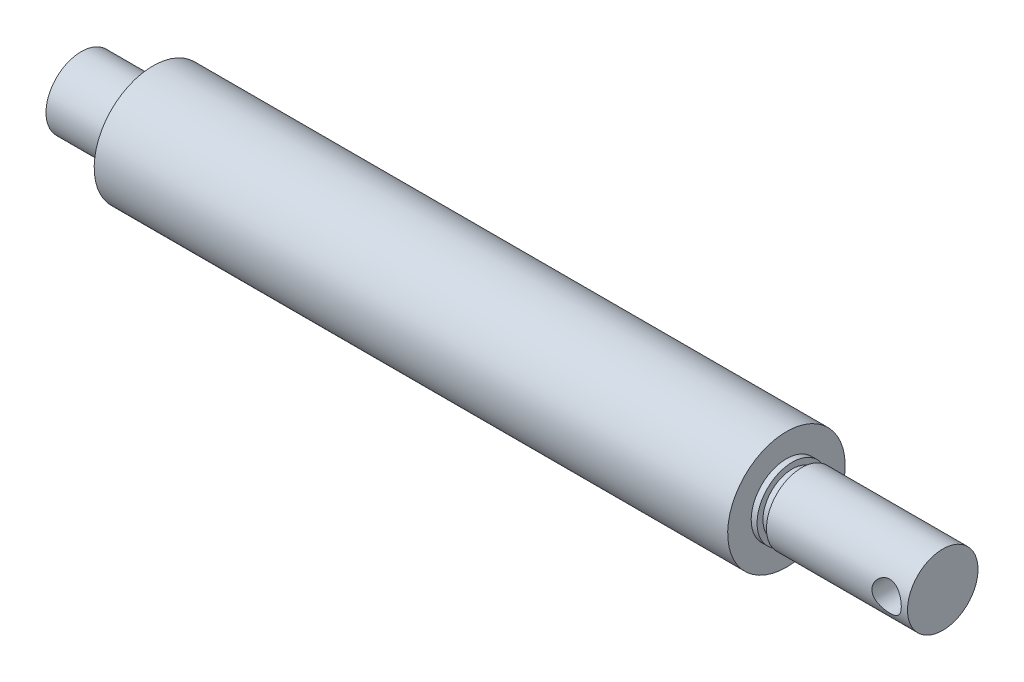
ISO-10303-21;
HEADER;
FILE_DESCRIPTION(('STEP AP214'),'2;1');
FILE_NAME('part.step','',(''),(''),'','','');
FILE_SCHEMA(('AUTOMOTIVE_DESIGN { 1 0 10303 214 1 1 1 1 }'));
ENDSEC;
DATA;
#1=APPLICATION_CONTEXT('core data for automotive mechanical design processes');
#2=APPLICATION_PROTOCOL_DEFINITION('international standard','automotive_design',2000,#1);
#3=PRODUCT_CONTEXT('',#1,'mechanical');
#4=PRODUCT('Part','Part','',(#3));
#5=PRODUCT_RELATED_PRODUCT_CATEGORY('part','',(#4));
#6=PRODUCT_DEFINITION_FORMATION('','',#4);
#7=PRODUCT_DEFINITION_CONTEXT('part definition',#1,'design');
#8=PRODUCT_DEFINITION('design','',#6,#7);
#9=PRODUCT_DEFINITION_SHAPE('','',#8);
#10=(LENGTH_UNIT() NAMED_UNIT(*) SI_UNIT(.MILLI.,.METRE.));
#11=(NAMED_UNIT(*) PLANE_ANGLE_UNIT() SI_UNIT($,.RADIAN.));
#12=(NAMED_UNIT(*) SI_UNIT($,.STERADIAN.) SOLID_ANGLE_UNIT());
#13=UNCERTAINTY_MEASURE_WITH_UNIT(LENGTH_MEASURE(1.E-05),#10,'distance_accuracy_value','');
#14=(GEOMETRIC_REPRESENTATION_CONTEXT(3) GLOBAL_UNCERTAINTY_ASSIGNED_CONTEXT((#13)) GLOBAL_UNIT_ASSIGNED_CONTEXT((#10,
#11,#12)) REPRESENTATION_CONTEXT('',''));
#15=CARTESIAN_POINT('',(0.,0.,0.));
#16=DIRECTION('',(0.,0.,1.));
#17=DIRECTION('',(1.,0.,0.));
#18=AXIS2_PLACEMENT_3D('',#15,#16,#17);
#19=CARTESIAN_POINT('',(0.,3.,0.));
#20=DIRECTION('',(1.,0.,0.));
#21=DIRECTION('',(0.,1.,0.));
#22=AXIS2_PLACEMENT_3D('',#19,#20,#21);
#23=PLANE('',#22);
#24=CARTESIAN_POINT('',(0.,0.,0.));
#25=DIRECTION('',(-1.,0.,0.));
#26=DIRECTION('',(0.,-1.,0.));
#27=AXIS2_PLACEMENT_3D('',#24,#25,#26);
#28=CIRCLE('',#27,3.);
#29=CARTESIAN_POINT('',(0.,-3.,0.));
#30=VERTEX_POINT('',#29);
#31=EDGE_CURVE('E127',#30,#30,#28,.T.);
#32=ORIENTED_EDGE('',*,*,#31,.T.);
#33=EDGE_LOOP('',(#32));
#34=FACE_BOUND('',#33,.T.);
#35=ADVANCED_FACE('F33',(#34),#23,.F.);
#36=CARTESIAN_POINT('',(73.3,0.,0.));
#37=DIRECTION('',(-1.,0.,0.));
#38=DIRECTION('',(0.,-1.,0.));
#39=AXIS2_PLACEMENT_3D('',#36,#37,#38);
#40=PLANE('',#39);
#41=CARTESIAN_POINT('',(73.3,0.,0.));
#42=DIRECTION('',(-1.,0.,0.));
#43=DIRECTION('',(0.,-1.,0.));
#44=AXIS2_PLACEMENT_3D('',#41,#42,#43);
#45=CIRCLE('',#44,2.99999999999999);
#46=CARTESIAN_POINT('',(73.3,-2.99999999999997,0.));
#47=VERTEX_POINT('',#46);
#48=EDGE_CURVE('E10',#47,#47,#45,.T.);
#49=ORIENTED_EDGE('',*,*,#48,.F.);
#50=EDGE_LOOP('',(#49));
#51=FACE_BOUND('',#50,.T.);
#52=ADVANCED_FACE('F115',(#51),#40,.F.);
#53=CARTESIAN_POINT('',(0.,0.,0.));
#54=DIRECTION('',(-1.,0.,0.));
#55=DIRECTION('',(0.,-1.,0.));
#56=AXIS2_PLACEMENT_3D('',#53,#54,#55);
#57=CYLINDRICAL_SURFACE('',#56,2.99999999999999);
#58=CARTESIAN_POINT('',(70.27,0.,2.99999999999999));
#59=CARTESIAN_POINT('',(70.2700072050913,0.0669580526362662,2.99999458367272));
#60=CARTESIAN_POINT('',(70.2754119585281,0.134021397063839,2.99773232974709));
#61=CARTESIAN_POINT('',(70.2968390649202,0.266247371156345,2.98890153579551));
#62=CARTESIAN_POINT('',(70.3128891244642,0.331404576423564,2.98232175901027));
#63=CARTESIAN_POINT('',(70.3549110917806,0.457688733653087,2.96556289038126));
#64=CARTESIAN_POINT('',(70.3808493894682,0.518828524426267,2.95539599975003));
#65=CARTESIAN_POINT('',(70.4417728232326,0.635829756679799,2.93245286470663));
#66=CARTESIAN_POINT('',(70.4767552189709,0.691692790015936,2.91967741092848));
#67=CARTESIAN_POINT('',(70.5566289825909,0.799448403559509,2.89207828351868));
#68=CARTESIAN_POINT('',(70.6019013087897,0.851041267517767,2.87718753326092));
#69=CARTESIAN_POINT('',(70.7002643347826,0.94615982109126,2.84732714068513));
#70=CARTESIAN_POINT('',(70.7533591248945,0.989681263153082,2.83235746106809));
#71=CARTESIAN_POINT('',(70.8690267775649,1.06953737697065,2.80321021812995));
#72=CARTESIAN_POINT('',(70.9319374484265,1.10541308153925,2.78910786873384));
#73=CARTESIAN_POINT('',(71.0635732579209,1.16593940588865,2.76435572357005));
#74=CARTESIAN_POINT('',(71.1322953794844,1.1905958083629,2.75370415000823));
#75=CARTESIAN_POINT('',(71.2701536917679,1.22674598312159,2.73778555387704));
#76=CARTESIAN_POINT('',(71.3391104833922,1.23881657877605,2.73228387651787));
#77=CARTESIAN_POINT('',(71.4782732926866,1.25125209967796,2.72661326219503));
#78=CARTESIAN_POINT('',(71.5484786000257,1.25162348054397,2.72644138425259));
#79=CARTESIAN_POINT('',(71.6824000604349,1.24108450363674,2.73125119560852));
#80=CARTESIAN_POINT('',(71.7462010965645,1.23103681112301,2.73583882723622));
#81=CARTESIAN_POINT('',(71.8711120910004,1.20139191015776,2.74898482773796));
#82=CARTESIAN_POINT('',(71.9322215314918,1.18179287287177,2.75754395703563));
#83=CARTESIAN_POINT('',(72.0515577029914,1.13321958727571,2.77786184772756));
#84=CARTESIAN_POINT('',(72.1096954209134,1.10405471539236,2.78968481949136));
#85=CARTESIAN_POINT('',(72.2204777338801,1.03731242580562,2.81518331141085));
#86=CARTESIAN_POINT('',(72.2731201506135,0.999731690519543,2.82885956129779));
#87=CARTESIAN_POINT('',(72.3760999587328,0.913495965543833,2.85792976877979));
#88=CARTESIAN_POINT('',(72.4258665673854,0.864173483207525,2.87337121404472));
#89=CARTESIAN_POINT('',(72.5166135029592,0.75772959105151,2.90325673112529));
#90=CARTESIAN_POINT('',(72.5575917716922,0.700606359448454,2.91770056877009));
#91=CARTESIAN_POINT('',(72.6304358236163,0.578447948693373,2.94438283556472));
#92=CARTESIAN_POINT('',(72.6620694451507,0.513260582447676,2.95656266543333));
#93=CARTESIAN_POINT('',(72.7137211396033,0.377852402526825,2.97689481414802));
#94=CARTESIAN_POINT('',(72.7337456319438,0.307634394795028,2.98504935845799));
#95=CARTESIAN_POINT('',(72.7604159921266,0.168928113346221,2.99599641186384));
#96=CARTESIAN_POINT('',(72.7678278574437,0.100611285278634,2.99909541047124));
#97=CARTESIAN_POINT('',(72.7713462236141,-0.0363546554960921,3.00056050368743));
#98=CARTESIAN_POINT('',(72.767455970252,-0.105003667152637,2.99892795711938));
#99=CARTESIAN_POINT('',(72.7490289151939,-0.237098242341435,2.99131217656939));
#100=CARTESIAN_POINT('',(72.7350300459028,-0.300632966639386,2.98554887283988));
#101=CARTESIAN_POINT('',(72.6975318054592,-0.42438274897109,2.97048606772413));
#102=CARTESIAN_POINT('',(72.6740312340497,-0.484597386518361,2.96118611959702));
#103=CARTESIAN_POINT('',(72.6174290242879,-0.602108999869136,2.93958270645164));
#104=CARTESIAN_POINT('',(72.584051816854,-0.659257236855322,2.9271949146928));
#105=CARTESIAN_POINT('',(72.5089466222083,-0.767346216231425,2.90073804579089));
#106=CARTESIAN_POINT('',(72.4672151484707,-0.818284352601938,2.88666826768731));
#107=CARTESIAN_POINT('',(72.3730967667276,-0.916333430274263,2.85712087895436));
#108=CARTESIAN_POINT('',(72.3201614970137,-0.962910697979836,2.84161451591027));
#109=CARTESIAN_POINT('',(72.2069787240646,-1.04666984610551,2.81184336768003));
#110=CARTESIAN_POINT('',(72.1467295648283,-1.08384959285617,2.79757886493437));
#111=CARTESIAN_POINT('',(72.0193858246974,-1.14815960208699,2.77181386243986));
#112=CARTESIAN_POINT('',(71.9522059644852,-1.17513918237329,2.7603556255511));
#113=CARTESIAN_POINT('',(71.8136294061899,-1.21717413951572,2.74208355658955));
#114=CARTESIAN_POINT('',(71.7422362375167,-1.23223934863687,2.7352658955575));
#115=CARTESIAN_POINT('',(71.6031813008008,-1.249040803489,2.72763164537262));
#116=CARTESIAN_POINT('',(71.5356553377074,-1.25171380413129,2.72639350967161));
#117=CARTESIAN_POINT('',(71.4011571388589,-1.24615575523912,2.72893853011022));
#118=CARTESIAN_POINT('',(71.3341848196863,-1.23792637964721,2.73272091540304));
#119=CARTESIAN_POINT('',(71.2059072525311,-1.21158404780491,2.74449551302266));
#120=CARTESIAN_POINT('',(71.1444833265366,-1.19394903571466,2.75228354846478));
#121=CARTESIAN_POINT('',(71.0254519786428,-1.14976328202134,2.77103181199187));
#122=CARTESIAN_POINT('',(70.9678456346012,-1.12321003517251,2.78199293131692));
#123=CARTESIAN_POINT('',(70.8543041040509,-1.06010285935489,2.80666954560011));
#124=CARTESIAN_POINT('',(70.7986776698317,-1.02304360910483,2.82051102713678));
#125=CARTESIAN_POINT('',(70.6941398606393,-0.940684072630389,2.84903689053838));
#126=CARTESIAN_POINT('',(70.6452308243994,-0.895380928905616,2.86372156345873));
#127=CARTESIAN_POINT('',(70.5518513183153,-0.793902045778816,2.89356392850105));
#128=CARTESIAN_POINT('',(70.5079635671594,-0.737174739949023,2.9086781751179));
#129=CARTESIAN_POINT('',(70.4303005464564,-0.616600079253197,2.93660143622018));
#130=CARTESIAN_POINT('',(70.3965298851104,-0.552749497945746,2.94940939916739));
#131=CARTESIAN_POINT('',(70.3407901545601,-0.420732056717953,2.97109183362459));
#132=CARTESIAN_POINT('',(70.3186352333827,-0.352653990980638,2.98002782581962));
#133=CARTESIAN_POINT('',(70.2862936709222,-0.213410421846559,2.99321009768623));
#134=CARTESIAN_POINT('',(70.2760695574701,-0.142255316980956,2.99747105811965));
#135=CARTESIAN_POINT('',(70.2706668389136,-0.0472360819191816,2.99972287568932));
#136=CARTESIAN_POINT('',(70.2699974578508,-0.0236245946756562,3.00000191102535));
#137=CARTESIAN_POINT('',(70.27,0.,2.99999999999999));
#138=B_SPLINE_CURVE_WITH_KNOTS('',3,(#58,#59,#60,#61,#62,#63,#64,#65,#66,#67,#68,#69,#70,#71,
#72,#73,#74,#75,#76,#77,#78,#79,#80,#81,#82,#83,#84,#85,#86,#87,#88,#89,#90,#91,#92,#93,#94,#95,
#96,#97,#98,#99,#100,#101,#102,#103,#104,#105,#106,#107,#108,#109,#110,#111,#112,#113,#114,#115,
#116,#117,#118,#119,#120,#121,#122,#123,#124,#125,#126,#127,#128,#129,#130,#131,#132,#133,#134,
#135,#136,#137),.UNSPECIFIED.,.T.,.F.,(4,2,2,2,2,2,2,2,2,2,2,2,2,2,2,2,2,2,2,2,2,2,2,2,2,2,2,2,
2,2,2,2,2,2,2,2,2,2,2,4),(0.,0.200806918883937,0.402138540628694,0.602791851906296,
0.803384436852974,1.01317936288807,1.22308438131465,1.44331724539124,1.66343646730587,
1.87295273137557,2.08235338249046,2.27570157202556,2.46908679727213,2.66658713058713,
2.86416545717206,3.07844141127897,3.29276749314588,3.51204055060814,3.73119224218297,
3.93648443393251,4.14171767493171,4.33676589735721,4.53183876601784,4.73297135272161,
4.93418805469496,5.14978488029294,5.36543061240341,5.58414788359523,5.80268447074579,
6.00439877559642,6.20608211297537,6.39837649964763,6.59072494950613,6.79463893397441,
6.99862373425943,7.21746535004889,7.43640649428582,7.65172855819385,7.86637250469321,
7.93722256499098),.UNSPECIFIED.);
#139=CARTESIAN_POINT('',(70.27,0.,2.99999999999999));
#140=VERTEX_POINT('',#139);
#141=EDGE_CURVE('E36',#140,#140,#138,.T.);
#142=ORIENTED_EDGE('',*,*,#141,.T.);
#143=EDGE_LOOP('',(#142));
#144=FACE_BOUND('',#143,.T.);
#145=CARTESIAN_POINT('',(70.27,0.,-2.99999999999999));
#146=CARTESIAN_POINT('',(70.2700072050913,-0.0669580526362663,-2.99999458367271));
#147=CARTESIAN_POINT('',(70.2754119585281,-0.13402139706384,-2.99773232974709));
#148=CARTESIAN_POINT('',(70.2968390649202,-0.266247371156346,-2.9889015357955));
#149=CARTESIAN_POINT('',(70.3128891244642,-0.331404576423564,-2.98232175901026));
#150=CARTESIAN_POINT('',(70.3549110917806,-0.457688733653088,-2.96556289038126));
#151=CARTESIAN_POINT('',(70.3808493894682,-0.518828524426267,-2.95539599975002));
#152=CARTESIAN_POINT('',(70.4417728232326,-0.6358297566798,-2.93245286470663));
#153=CARTESIAN_POINT('',(70.4767552189709,-0.691692790015937,-2.91967741092848));
#154=CARTESIAN_POINT('',(70.5566289825909,-0.79944840355951,-2.89207828351867));
#155=CARTESIAN_POINT('',(70.6019013087897,-0.851041267517767,-2.87718753326091));
#156=CARTESIAN_POINT('',(70.7002643347826,-0.94615982109126,-2.84732714068512));
#157=CARTESIAN_POINT('',(70.7533591248945,-0.989681263153082,-2.83235746106808));
#158=CARTESIAN_POINT('',(70.8690267775649,-1.06953737697065,-2.80321021812993));
#159=CARTESIAN_POINT('',(70.9319374484265,-1.10541308153925,-2.78910786873383));
#160=CARTESIAN_POINT('',(71.0635732579209,-1.16593940588865,-2.76435572357003));
#161=CARTESIAN_POINT('',(71.1322953794844,-1.1905958083629,-2.75370415000822));
#162=CARTESIAN_POINT('',(71.2701536917679,-1.22674598312159,-2.73778555387703));
#163=CARTESIAN_POINT('',(71.3391104833922,-1.23881657877605,-2.73228387651785));
#164=CARTESIAN_POINT('',(71.4782732926866,-1.25125209967796,-2.72661326219502));
#165=CARTESIAN_POINT('',(71.5484786000257,-1.25162348054397,-2.72644138425258));
#166=CARTESIAN_POINT('',(71.6824000604349,-1.24108450363674,-2.73125119560851));
#167=CARTESIAN_POINT('',(71.7462010965645,-1.23103681112301,-2.73583882723621));
#168=CARTESIAN_POINT('',(71.8711120910004,-1.20139191015776,-2.74898482773794));
#169=CARTESIAN_POINT('',(71.9322215314918,-1.18179287287177,-2.75754395703562));
#170=CARTESIAN_POINT('',(72.0515577029914,-1.13321958727571,-2.77786184772755));
#171=CARTESIAN_POINT('',(72.1096954209134,-1.10405471539236,-2.78968481949134));
#172=CARTESIAN_POINT('',(72.2204777338801,-1.03731242580562,-2.81518331141084));
#173=CARTESIAN_POINT('',(72.2731201506135,-0.999731690519541,-2.82885956129778));
#174=CARTESIAN_POINT('',(72.3760999587328,-0.913495965543833,-2.85792976877978));
#175=CARTESIAN_POINT('',(72.4258665673854,-0.864173483207525,-2.87337121404471));
#176=CARTESIAN_POINT('',(72.5166135029592,-0.757729591051512,-2.90325673112528));
#177=CARTESIAN_POINT('',(72.5575917716922,-0.700606359448457,-2.91770056877008));
#178=CARTESIAN_POINT('',(72.6304358236163,-0.578447948693375,-2.94438283556471));
#179=CARTESIAN_POINT('',(72.6620694451507,-0.513260582447676,-2.95656266543332));
#180=CARTESIAN_POINT('',(72.7137211396033,-0.377852402526824,-2.97689481414802));
#181=CARTESIAN_POINT('',(72.7337456319438,-0.307634394795029,-2.98504935845799));
#182=CARTESIAN_POINT('',(72.7604159921266,-0.168928113346224,-2.99599641186384));
#183=CARTESIAN_POINT('',(72.7678278574437,-0.100611285278636,-2.99909541047124));
#184=CARTESIAN_POINT('',(72.7713462236141,0.0363546554960907,-3.00056050368744));
#185=CARTESIAN_POINT('',(72.767455970252,0.105003667152636,-2.99892795711938));
#186=CARTESIAN_POINT('',(72.7490289151939,0.237098242341434,-2.99131217656939));
#187=CARTESIAN_POINT('',(72.7350300459028,0.300632966639385,-2.98554887283989));
#188=CARTESIAN_POINT('',(72.6975318054592,0.42438274897109,-2.97048606772413));
#189=CARTESIAN_POINT('',(72.6740312340497,0.484597386518361,-2.96118611959703));
#190=CARTESIAN_POINT('',(72.6174290242879,0.602108999869136,-2.93958270645165));
#191=CARTESIAN_POINT('',(72.584051816854,0.659257236855322,-2.92719491469281));
#192=CARTESIAN_POINT('',(72.5089466222083,0.767346216231426,-2.9007380457909));
#193=CARTESIAN_POINT('',(72.4672151484707,0.818284352601938,-2.88666826768732));
#194=CARTESIAN_POINT('',(72.3730967667276,0.916333430274263,-2.85712087895437));
#195=CARTESIAN_POINT('',(72.3201614970137,0.962910697979836,-2.84161451591028));
#196=CARTESIAN_POINT('',(72.2069787240646,1.04666984610551,-2.81184336768005));
#197=CARTESIAN_POINT('',(72.1467295648283,1.08384959285617,-2.79757886493438));
#198=CARTESIAN_POINT('',(72.0193858246974,1.14815960208699,-2.77181386243988));
#199=CARTESIAN_POINT('',(71.9522059644852,1.17513918237329,-2.76035562555111));
#200=CARTESIAN_POINT('',(71.8136294061899,1.21717413951572,-2.74208355658957));
#201=CARTESIAN_POINT('',(71.7422362375167,1.23223934863687,-2.73526589555752));
#202=CARTESIAN_POINT('',(71.6031813008008,1.249040803489,-2.72763164537264));
#203=CARTESIAN_POINT('',(71.5356553377074,1.25171380413129,-2.72639350967162));
#204=CARTESIAN_POINT('',(71.4011571388589,1.24615575523912,-2.72893853011023));
#205=CARTESIAN_POINT('',(71.3341848196863,1.23792637964721,-2.73272091540306));
#206=CARTESIAN_POINT('',(71.2059072525311,1.21158404780491,-2.74449551302267));
#207=CARTESIAN_POINT('',(71.1444833265366,1.19394903571466,-2.7522835484648));
#208=CARTESIAN_POINT('',(71.0254519786428,1.14976328202134,-2.77103181199189));
#209=CARTESIAN_POINT('',(70.9678456346012,1.12321003517251,-2.78199293131693));
#210=CARTESIAN_POINT('',(70.8543041040509,1.06010285935489,-2.80666954560013));
#211=CARTESIAN_POINT('',(70.7986776698317,1.02304360910483,-2.82051102713679));
#212=CARTESIAN_POINT('',(70.6941398606393,0.940684072630388,-2.84903689053839));
#213=CARTESIAN_POINT('',(70.6452308243994,0.895380928905615,-2.86372156345874));
#214=CARTESIAN_POINT('',(70.5518513183153,0.793902045778816,-2.89356392850106));
#215=CARTESIAN_POINT('',(70.5079635671594,0.737174739949023,-2.90867817511791));
#216=CARTESIAN_POINT('',(70.4303005464564,0.616600079253196,-2.93660143622019));
#217=CARTESIAN_POINT('',(70.3965298851104,0.552749497945746,-2.94940939916739));
#218=CARTESIAN_POINT('',(70.3407901545601,0.420732056717952,-2.9710918336246));
#219=CARTESIAN_POINT('',(70.3186352333827,0.352653990980636,-2.98002782581963));
#220=CARTESIAN_POINT('',(70.2862936709222,0.213410421846557,-2.99321009768624));
#221=CARTESIAN_POINT('',(70.2760695574701,0.142255316980955,-2.99747105811966));
#222=CARTESIAN_POINT('',(70.2706668389136,0.0472360819191807,-2.99972287568932));
#223=CARTESIAN_POINT('',(70.2699974578508,0.0236245946756558,-3.00000191102535));
#224=CARTESIAN_POINT('',(70.27,0.,-2.99999999999999));
#225=B_SPLINE_CURVE_WITH_KNOTS('',3,(#145,#146,#147,#148,#149,#150,#151,#152,#153,#154,#155,
#156,#157,#158,#159,#160,#161,#162,#163,#164,#165,#166,#167,#168,#169,#170,#171,#172,#173,#174,
#175,#176,#177,#178,#179,#180,#181,#182,#183,#184,#185,#186,#187,#188,#189,#190,#191,#192,#193,
#194,#195,#196,#197,#198,#199,#200,#201,#202,#203,#204,#205,#206,#207,#208,#209,#210,#211,#212,
#213,#214,#215,#216,#217,#218,#219,#220,#221,#222,#223,#224),.UNSPECIFIED.,.T.,.F.,(4,2,2,2,2,2,
2,2,2,2,2,2,2,2,2,2,2,2,2,2,2,2,2,2,2,2,2,2,2,2,2,2,2,2,2,2,2,2,2,4),(0.,0.200806918883938,
0.402138540628695,0.602791851906297,0.803384436852976,1.01317936288807,1.22308438131465,
1.44331724539124,1.66343646730587,1.87295273137557,2.08235338249047,2.27570157202556,
2.46908679727213,2.66658713058715,2.86416545717206,3.07844141127897,3.29276749314588,
3.51204055060814,3.73119224218298,3.93648443393251,4.14171767493172,4.33676589735721,
4.53183876601785,4.73297135272161,4.93418805469496,5.14978488029295,5.36543061240341,
5.58414788359524,5.80268447074579,6.00439877559642,6.20608211297537,6.39837649964764,
6.59072494950613,6.79463893397441,6.99862373425944,7.21746535004889,7.43640649428582,
7.65172855819385,7.86637250469321,7.93722256499098),.UNSPECIFIED.);
#226=CARTESIAN_POINT('',(70.27,0.,-2.99999999999999));
#227=VERTEX_POINT('',#226);
#228=EDGE_CURVE('E52',#227,#227,#225,.T.);
#229=ORIENTED_EDGE('',*,*,#228,.T.);
#230=EDGE_LOOP('',(#229));
#231=FACE_BOUND('',#230,.T.);
#232=CARTESIAN_POINT('',(61.3,0.,0.));
#233=DIRECTION('',(-1.,0.,0.));
#234=DIRECTION('',(0.,-1.,0.));
#235=AXIS2_PLACEMENT_3D('',#232,#233,#234);
#236=CIRCLE('',#235,2.99999999999999);
#237=CARTESIAN_POINT('',(61.3,-2.99999999999997,0.));
#238=VERTEX_POINT('',#237);
#239=EDGE_CURVE('E44',#238,#238,#236,.T.);
#240=ORIENTED_EDGE('',*,*,#239,.F.);
#241=EDGE_LOOP('',(#240));
#242=FACE_BOUND('',#241,.T.);
#243=ORIENTED_EDGE('',*,*,#48,.T.);
#244=EDGE_LOOP('',(#243));
#245=FACE_BOUND('',#244,.T.);
#246=ADVANCED_FACE('F56',(#144,#231,#242,#245),#57,.T.);
#247=CARTESIAN_POINT('',(61.3,3.,0.));
#248=DIRECTION('',(1.,0.,0.));
#249=DIRECTION('',(0.,1.,0.));
#250=AXIS2_PLACEMENT_3D('',#247,#248,#249);
#251=PLANE('',#250);
#252=CARTESIAN_POINT('',(61.3,0.,0.));
#253=DIRECTION('',(-1.,0.,0.));
#254=DIRECTION('',(0.,-1.,0.));
#255=AXIS2_PLACEMENT_3D('',#252,#253,#254);
#256=CIRCLE('',#255,2.49999999999999);
#257=CARTESIAN_POINT('',(61.3,-2.49999999999997,0.));
#258=VERTEX_POINT('',#257);
#259=EDGE_CURVE('E49',#258,#258,#256,.T.);
#260=ORIENTED_EDGE('',*,*,#259,.F.);
#261=EDGE_LOOP('',(#260));
#262=FACE_BOUND('',#261,.T.);
#263=ORIENTED_EDGE('',*,*,#239,.T.);
#264=EDGE_LOOP('',(#263));
#265=FACE_BOUND('',#264,.T.);
#266=ADVANCED_FACE('F107',(#262,#265),#251,.F.);
#267=CARTESIAN_POINT('',(0.,0.,0.));
#268=DIRECTION('',(-1.,0.,0.));
#269=DIRECTION('',(0.,-1.,0.));
#270=AXIS2_PLACEMENT_3D('',#267,#268,#269);
#271=CYLINDRICAL_SURFACE('',#270,2.49999999999999);
#272=CARTESIAN_POINT('',(60.5,0.,0.));
#273=DIRECTION('',(-1.,0.,0.));
#274=DIRECTION('',(0.,-1.,0.));
#275=AXIS2_PLACEMENT_3D('',#272,#273,#274);
#276=CIRCLE('',#275,2.49999999999999);
#277=CARTESIAN_POINT('',(60.5,-2.49999999999997,0.));
#278=VERTEX_POINT('',#277);
#279=EDGE_CURVE('E158',#278,#278,#276,.T.);
#280=ORIENTED_EDGE('',*,*,#279,.F.);
#281=EDGE_LOOP('',(#280));
#282=FACE_BOUND('',#281,.T.);
#283=ORIENTED_EDGE('',*,*,#259,.T.);
#284=EDGE_LOOP('',(#283));
#285=FACE_BOUND('',#284,.T.);
#286=ADVANCED_FACE('F104',(#282,#285),#271,.T.);
#287=CARTESIAN_POINT('',(60.5,2.5,0.));
#288=DIRECTION('',(-1.,0.,0.));
#289=DIRECTION('',(0.,-1.,0.));
#290=AXIS2_PLACEMENT_3D('',#287,#288,#289);
#291=PLANE('',#290);
#292=CARTESIAN_POINT('',(60.5,0.,0.));
#293=DIRECTION('',(-1.,0.,0.));
#294=DIRECTION('',(0.,-1.,0.));
#295=AXIS2_PLACEMENT_3D('',#292,#293,#294);
#296=CIRCLE('',#295,2.99999999999999);
#297=CARTESIAN_POINT('',(60.5,-2.99999999999997,0.));
#298=VERTEX_POINT('',#297);
#299=EDGE_CURVE('E155',#298,#298,#296,.T.);
#300=ORIENTED_EDGE('',*,*,#299,.F.);
#301=EDGE_LOOP('',(#300));
#302=FACE_BOUND('',#301,.T.);
#303=ORIENTED_EDGE('',*,*,#279,.T.);
#304=EDGE_LOOP('',(#303));
#305=FACE_BOUND('',#304,.T.);
#306=ADVANCED_FACE('F100',(#302,#305),#291,.F.);
#307=CARTESIAN_POINT('',(0.,0.,0.));
#308=DIRECTION('',(-1.,0.,0.));
#309=DIRECTION('',(0.,-1.,0.));
#310=AXIS2_PLACEMENT_3D('',#307,#308,#309);
#311=CYLINDRICAL_SURFACE('',#310,2.99999999999999);
#312=CARTESIAN_POINT('',(60.,0.,0.));
#313=DIRECTION('',(-1.,0.,0.));
#314=DIRECTION('',(0.,-1.,0.));
#315=AXIS2_PLACEMENT_3D('',#312,#313,#314);
#316=CIRCLE('',#315,2.99999999999999);
#317=CARTESIAN_POINT('',(60.,-2.99999999999997,0.));
#318=VERTEX_POINT('',#317);
#319=EDGE_CURVE('E152',#318,#318,#316,.T.);
#320=ORIENTED_EDGE('',*,*,#319,.F.);
#321=EDGE_LOOP('',(#320));
#322=FACE_BOUND('',#321,.T.);
#323=ORIENTED_EDGE('',*,*,#299,.T.);
#324=EDGE_LOOP('',(#323));
#325=FACE_BOUND('',#324,.T.);
#326=ADVANCED_FACE('F96',(#322,#325),#311,.T.);
#327=CARTESIAN_POINT('',(60.,3.,0.));
#328=DIRECTION('',(-1.,0.,0.));
#329=DIRECTION('',(0.,-1.,0.));
#330=AXIS2_PLACEMENT_3D('',#327,#328,#329);
#331=PLANE('',#330);
#332=CARTESIAN_POINT('',(60.,0.,0.));
#333=DIRECTION('',(-1.,0.,0.));
#334=DIRECTION('',(0.,-1.,0.));
#335=AXIS2_PLACEMENT_3D('',#332,#333,#334);
#336=CIRCLE('',#335,4.99999999999997);
#337=CARTESIAN_POINT('',(60.,-4.99999999999996,0.));
#338=VERTEX_POINT('',#337);
#339=EDGE_CURVE('E149',#338,#338,#336,.T.);
#340=ORIENTED_EDGE('',*,*,#339,.F.);
#341=EDGE_LOOP('',(#340));
#342=FACE_BOUND('',#341,.T.);
#343=ORIENTED_EDGE('',*,*,#319,.T.);
#344=EDGE_LOOP('',(#343));
#345=FACE_BOUND('',#344,.T.);
#346=ADVANCED_FACE('F92',(#342,#345),#331,.F.);
#347=CARTESIAN_POINT('',(0.,0.,0.));
#348=DIRECTION('',(-1.,0.,0.));
#349=DIRECTION('',(0.,-1.,0.));
#350=AXIS2_PLACEMENT_3D('',#347,#348,#349);
#351=CYLINDRICAL_SURFACE('',#350,4.99999999999998);
#352=CARTESIAN_POINT('',(6.09999999999999,0.,0.));
#353=DIRECTION('',(-1.,0.,0.));
#354=DIRECTION('',(0.,-1.,0.));
#355=AXIS2_PLACEMENT_3D('',#352,#353,#354);
#356=CIRCLE('',#355,4.99999999999998);
#357=CARTESIAN_POINT('',(6.09999999999999,-4.99999999999998,0.));
#358=VERTEX_POINT('',#357);
#359=EDGE_CURVE('E146',#358,#358,#356,.T.);
#360=ORIENTED_EDGE('',*,*,#359,.F.);
#361=EDGE_LOOP('',(#360));
#362=FACE_BOUND('',#361,.T.);
#363=ORIENTED_EDGE('',*,*,#339,.T.);
#364=EDGE_LOOP('',(#363));
#365=FACE_BOUND('',#364,.T.);
#366=ADVANCED_FACE('F88',(#362,#365),#351,.T.);
#367=CARTESIAN_POINT('',(6.09999999999999,4.99999999999998,0.));
#368=DIRECTION('',(1.,0.,0.));
#369=DIRECTION('',(0.,1.,0.));
#370=AXIS2_PLACEMENT_3D('',#367,#368,#369);
#371=PLANE('',#370);
#372=CARTESIAN_POINT('',(6.09999999999999,0.,0.));
#373=DIRECTION('',(-1.,0.,0.));
#374=DIRECTION('',(0.,-1.,0.));
#375=AXIS2_PLACEMENT_3D('',#372,#373,#374);
#376=CIRCLE('',#375,3.);
#377=CARTESIAN_POINT('',(6.09999999999999,-3.,0.));
#378=VERTEX_POINT('',#377);
#379=EDGE_CURVE('E143',#378,#378,#376,.T.);
#380=ORIENTED_EDGE('',*,*,#379,.F.);
#381=EDGE_LOOP('',(#380));
#382=FACE_BOUND('',#381,.T.);
#383=ORIENTED_EDGE('',*,*,#359,.T.);
#384=EDGE_LOOP('',(#383));
#385=FACE_BOUND('',#384,.T.);
#386=ADVANCED_FACE('F84',(#382,#385),#371,.F.);
#387=CARTESIAN_POINT('',(0.,0.,0.));
#388=DIRECTION('',(-1.,0.,0.));
#389=DIRECTION('',(0.,-1.,0.));
#390=AXIS2_PLACEMENT_3D('',#387,#388,#389);
#391=CYLINDRICAL_SURFACE('',#390,3.);
#392=CARTESIAN_POINT('',(5.59999999999999,0.,0.));
#393=DIRECTION('',(-1.,0.,0.));
#394=DIRECTION('',(0.,-1.,0.));
#395=AXIS2_PLACEMENT_3D('',#392,#393,#394);
#396=CIRCLE('',#395,3.);
#397=CARTESIAN_POINT('',(5.59999999999999,-3.,0.));
#398=VERTEX_POINT('',#397);
#399=EDGE_CURVE('E140',#398,#398,#396,.T.);
#400=ORIENTED_EDGE('',*,*,#399,.F.);
#401=EDGE_LOOP('',(#400));
#402=FACE_BOUND('',#401,.T.);
#403=ORIENTED_EDGE('',*,*,#379,.T.);
#404=EDGE_LOOP('',(#403));
#405=FACE_BOUND('',#404,.T.);
#406=ADVANCED_FACE('F80',(#402,#405),#391,.T.);
#407=CARTESIAN_POINT('',(5.59999999999999,3.,0.));
#408=DIRECTION('',(1.,0.,0.));
#409=DIRECTION('',(0.,1.,0.));
#410=AXIS2_PLACEMENT_3D('',#407,#408,#409);
#411=PLANE('',#410);
#412=CARTESIAN_POINT('',(5.59999999999999,0.,0.));
#413=DIRECTION('',(-1.,0.,0.));
#414=DIRECTION('',(0.,-1.,0.));
#415=AXIS2_PLACEMENT_3D('',#412,#413,#414);
#416=CIRCLE('',#415,2.5);
#417=CARTESIAN_POINT('',(5.59999999999999,-2.5,0.));
#418=VERTEX_POINT('',#417);
#419=EDGE_CURVE('E137',#418,#418,#416,.T.);
#420=ORIENTED_EDGE('',*,*,#419,.F.);
#421=EDGE_LOOP('',(#420));
#422=FACE_BOUND('',#421,.T.);
#423=ORIENTED_EDGE('',*,*,#399,.T.);
#424=EDGE_LOOP('',(#423));
#425=FACE_BOUND('',#424,.T.);
#426=ADVANCED_FACE('F76',(#422,#425),#411,.F.);
#427=CARTESIAN_POINT('',(0.,0.,0.));
#428=DIRECTION('',(-1.,0.,0.));
#429=DIRECTION('',(0.,-1.,0.));
#430=AXIS2_PLACEMENT_3D('',#427,#428,#429);
#431=CYLINDRICAL_SURFACE('',#430,2.5);
#432=CARTESIAN_POINT('',(4.8,0.,0.));
#433=DIRECTION('',(-1.,0.,0.));
#434=DIRECTION('',(0.,-1.,0.));
#435=AXIS2_PLACEMENT_3D('',#432,#433,#434);
#436=CIRCLE('',#435,2.5);
#437=CARTESIAN_POINT('',(4.8,-2.5,0.));
#438=VERTEX_POINT('',#437);
#439=EDGE_CURVE('E131',#438,#438,#436,.T.);
#440=ORIENTED_EDGE('',*,*,#439,.F.);
#441=EDGE_LOOP('',(#440));
#442=FACE_BOUND('',#441,.T.);
#443=ORIENTED_EDGE('',*,*,#419,.T.);
#444=EDGE_LOOP('',(#443));
#445=FACE_BOUND('',#444,.T.);
#446=ADVANCED_FACE('F72',(#442,#445),#431,.T.);
#447=CARTESIAN_POINT('',(4.8,2.5,0.));
#448=DIRECTION('',(-1.,0.,0.));
#449=DIRECTION('',(0.,-1.,0.));
#450=AXIS2_PLACEMENT_3D('',#447,#448,#449);
#451=PLANE('',#450);
#452=CARTESIAN_POINT('',(4.8,0.,0.));
#453=DIRECTION('',(-1.,0.,0.));
#454=DIRECTION('',(0.,-1.,0.));
#455=AXIS2_PLACEMENT_3D('',#452,#453,#454);
#456=CIRCLE('',#455,3.);
#457=CARTESIAN_POINT('',(4.8,-3.,0.));
#458=VERTEX_POINT('',#457);
#459=EDGE_CURVE('E128',#458,#458,#456,.T.);
#460=ORIENTED_EDGE('',*,*,#459,.F.);
#461=EDGE_LOOP('',(#460));
#462=FACE_BOUND('',#461,.T.);
#463=ORIENTED_EDGE('',*,*,#439,.T.);
#464=EDGE_LOOP('',(#463));
#465=FACE_BOUND('',#464,.T.);
#466=ADVANCED_FACE('F68',(#462,#465),#451,.F.);
#467=CARTESIAN_POINT('',(0.,0.,0.));
#468=DIRECTION('',(-1.,0.,0.));
#469=DIRECTION('',(0.,-1.,0.));
#470=AXIS2_PLACEMENT_3D('',#467,#468,#469);
#471=CYLINDRICAL_SURFACE('',#470,3.);
#472=ORIENTED_EDGE('',*,*,#31,.F.);
#473=EDGE_LOOP('',(#472));
#474=FACE_BOUND('',#473,.T.);
#475=ORIENTED_EDGE('',*,*,#459,.T.);
#476=EDGE_LOOP('',(#475));
#477=FACE_BOUND('',#476,.T.);
#478=ADVANCED_FACE('F63',(#474,#477),#471,.T.);
#479=CARTESIAN_POINT('',(71.52,0.,5.));
#480=DIRECTION('',(0.,0.,-1.));
#481=DIRECTION('',(-1.,0.,0.));
#482=AXIS2_PLACEMENT_3D('',#479,#480,#481);
#483=CYLINDRICAL_SURFACE('',#482,1.25);
#484=ORIENTED_EDGE('',*,*,#228,.F.);
#485=EDGE_LOOP('',(#484));
#486=FACE_BOUND('',#485,.T.);
#487=ORIENTED_EDGE('',*,*,#141,.F.);
#488=EDGE_LOOP('',(#487));
#489=FACE_BOUND('',#488,.T.);
#490=ADVANCED_FACE('F59',(#486,#489),#483,.F.);
#491=CLOSED_SHELL('',(#35,#52,#246,#266,#286,#306,#326,#346,#366,#386,#406,#426,#446,#466,#478,#490));
#492=MANIFOLD_SOLID_BREP('B2',#491);
#493=ADVANCED_BREP_SHAPE_REPRESENTATION('',(#18,#492),#14);
#494=SHAPE_DEFINITION_REPRESENTATION(#9,#493);
ENDSEC;
END-ISO-10303-21;
